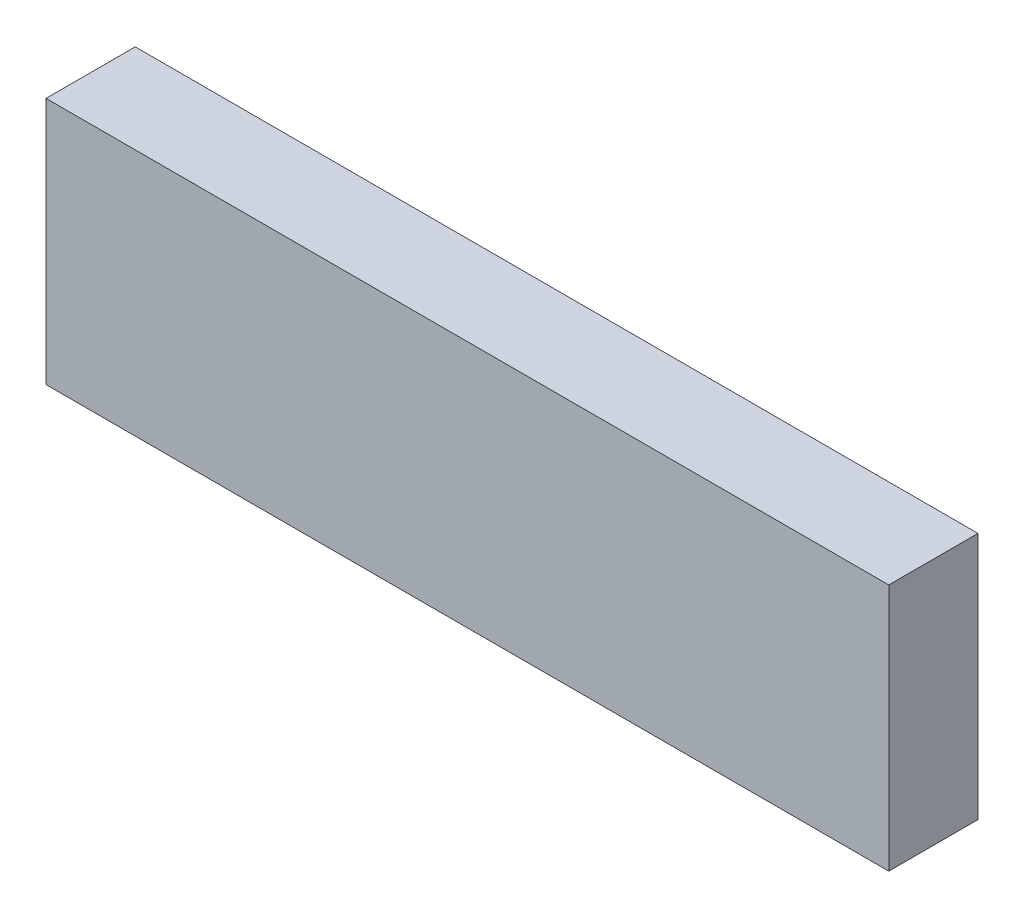
ISO-10303-21;
HEADER;
FILE_DESCRIPTION(('STEP AP214'),'2;1');
FILE_NAME('part.step','',(''),(''),'','','');
FILE_SCHEMA(('AUTOMOTIVE_DESIGN { 1 0 10303 214 1 1 1 1 }'));
ENDSEC;
DATA;
#1=APPLICATION_CONTEXT('core data for automotive mechanical design processes');
#2=APPLICATION_PROTOCOL_DEFINITION('international standard','automotive_design',2000,#1);
#3=PRODUCT_CONTEXT('',#1,'mechanical');
#4=PRODUCT('Part','Part','',(#3));
#5=PRODUCT_RELATED_PRODUCT_CATEGORY('part','',(#4));
#6=PRODUCT_DEFINITION_FORMATION('','',#4);
#7=PRODUCT_DEFINITION_CONTEXT('part definition',#1,'design');
#8=PRODUCT_DEFINITION('design','',#6,#7);
#9=PRODUCT_DEFINITION_SHAPE('','',#8);
#10=(LENGTH_UNIT() NAMED_UNIT(*) SI_UNIT(.MILLI.,.METRE.));
#11=(NAMED_UNIT(*) PLANE_ANGLE_UNIT() SI_UNIT($,.RADIAN.));
#12=(NAMED_UNIT(*) SI_UNIT($,.STERADIAN.) SOLID_ANGLE_UNIT());
#13=UNCERTAINTY_MEASURE_WITH_UNIT(LENGTH_MEASURE(1.E-05),#10,'distance_accuracy_value','');
#14=(GEOMETRIC_REPRESENTATION_CONTEXT(3) GLOBAL_UNCERTAINTY_ASSIGNED_CONTEXT((#13)) GLOBAL_UNIT_ASSIGNED_CONTEXT((#10,
#11,#12)) REPRESENTATION_CONTEXT('',''));
#15=CARTESIAN_POINT('',(0.,0.,0.));
#16=DIRECTION('',(0.,0.,1.));
#17=DIRECTION('',(1.,0.,0.));
#18=AXIS2_PLACEMENT_3D('',#15,#16,#17);
#19=CARTESIAN_POINT('',(0.,63.5,0.));
#20=DIRECTION('',(1.,0.,0.));
#21=DIRECTION('',(0.,0.,-1.));
#22=AXIS2_PLACEMENT_3D('',#19,#20,#21);
#23=PLANE('',#22);
#24=DIRECTION('',(0.,0.,1.));
#25=VECTOR('',#24,1.);
#26=CARTESIAN_POINT('',(0.,0.,0.));
#27=LINE('',#26,#25);
#28=CARTESIAN_POINT('',(0.,0.,-22.86));
#29=VERTEX_POINT('',#28);
#30=CARTESIAN_POINT('',(0.,0.,0.));
#31=VERTEX_POINT('',#30);
#32=EDGE_CURVE('E96',#29,#31,#27,.T.);
#33=ORIENTED_EDGE('',*,*,#32,.T.);
#34=DIRECTION('',(0.,-1.,0.));
#35=VECTOR('',#34,1.);
#36=CARTESIAN_POINT('',(0.,63.5,0.));
#37=LINE('',#36,#35);
#38=CARTESIAN_POINT('',(0.,63.5,0.));
#39=VERTEX_POINT('',#38);
#40=EDGE_CURVE('E11',#39,#31,#37,.T.);
#41=ORIENTED_EDGE('',*,*,#40,.F.);
#42=DIRECTION('',(0.,0.,1.));
#43=VECTOR('',#42,1.);
#44=CARTESIAN_POINT('',(0.,63.5,0.));
#45=LINE('',#44,#43);
#46=CARTESIAN_POINT('',(0.,63.5,-22.86));
#47=VERTEX_POINT('',#46);
#48=EDGE_CURVE('E84',#47,#39,#45,.T.);
#49=ORIENTED_EDGE('',*,*,#48,.F.);
#50=DIRECTION('',(0.,-1.,0.));
#51=VECTOR('',#50,1.);
#52=CARTESIAN_POINT('',(0.,63.5,-22.86));
#53=LINE('',#52,#51);
#54=EDGE_CURVE('E92',#47,#29,#53,.T.);
#55=ORIENTED_EDGE('',*,*,#54,.T.);
#56=EDGE_LOOP('',(#33,#41,#49,#55));
#57=FACE_BOUND('',#56,.T.);
#58=ADVANCED_FACE('F33',(#57),#23,.F.);
#59=CARTESIAN_POINT('',(0.,63.5,0.));
#60=DIRECTION('',(0.,0.,-1.));
#61=DIRECTION('',(-1.,0.,0.));
#62=AXIS2_PLACEMENT_3D('',#59,#60,#61);
#63=PLANE('',#62);
#64=DIRECTION('',(1.,0.,0.));
#65=VECTOR('',#64,1.);
#66=CARTESIAN_POINT('',(0.,0.,0.));
#67=LINE('',#66,#65);
#68=CARTESIAN_POINT('',(215.9,0.,0.));
#69=VERTEX_POINT('',#68);
#70=EDGE_CURVE('E88',#31,#69,#67,.T.);
#71=ORIENTED_EDGE('',*,*,#70,.T.);
#72=DIRECTION('',(0.,-1.,0.));
#73=VECTOR('',#72,1.);
#74=CARTESIAN_POINT('',(215.9,63.5,0.));
#75=LINE('',#74,#73);
#76=CARTESIAN_POINT('',(215.9,63.5,0.));
#77=VERTEX_POINT('',#76);
#78=EDGE_CURVE('E41',#77,#69,#75,.T.);
#79=ORIENTED_EDGE('',*,*,#78,.F.);
#80=DIRECTION('',(1.,0.,0.));
#81=VECTOR('',#80,1.);
#82=CARTESIAN_POINT('',(0.,63.5,0.));
#83=LINE('',#82,#81);
#84=EDGE_CURVE('E79',#39,#77,#83,.T.);
#85=ORIENTED_EDGE('',*,*,#84,.F.);
#86=ORIENTED_EDGE('',*,*,#40,.T.);
#87=EDGE_LOOP('',(#71,#79,#85,#86));
#88=FACE_BOUND('',#87,.T.);
#89=ADVANCED_FACE('F87',(#88),#63,.F.);
#90=CARTESIAN_POINT('',(215.9,63.5,0.));
#91=DIRECTION('',(-1.,0.,0.));
#92=DIRECTION('',(0.,0.,1.));
#93=AXIS2_PLACEMENT_3D('',#90,#91,#92);
#94=PLANE('',#93);
#95=DIRECTION('',(0.,0.,-1.));
#96=VECTOR('',#95,1.);
#97=CARTESIAN_POINT('',(215.9,0.,0.));
#98=LINE('',#97,#96);
#99=CARTESIAN_POINT('',(215.9,0.,-22.86));
#100=VERTEX_POINT('',#99);
#101=EDGE_CURVE('E66',#69,#100,#98,.T.);
#102=ORIENTED_EDGE('',*,*,#101,.T.);
#103=DIRECTION('',(0.,-1.,0.));
#104=VECTOR('',#103,1.);
#105=CARTESIAN_POINT('',(215.9,63.5,-22.86));
#106=LINE('',#105,#104);
#107=CARTESIAN_POINT('',(215.9,63.5,-22.86));
#108=VERTEX_POINT('',#107);
#109=EDGE_CURVE('E89',#108,#100,#106,.T.);
#110=ORIENTED_EDGE('',*,*,#109,.F.);
#111=DIRECTION('',(0.,0.,-1.));
#112=VECTOR('',#111,1.);
#113=CARTESIAN_POINT('',(215.9,63.5,0.));
#114=LINE('',#113,#112);
#115=EDGE_CURVE('E82',#77,#108,#114,.T.);
#116=ORIENTED_EDGE('',*,*,#115,.F.);
#117=ORIENTED_EDGE('',*,*,#78,.T.);
#118=EDGE_LOOP('',(#102,#110,#116,#117));
#119=FACE_BOUND('',#118,.T.);
#120=ADVANCED_FACE('F90',(#119),#94,.F.);
#121=CARTESIAN_POINT('',(0.,63.5,-22.86));
#122=DIRECTION('',(0.,0.,1.));
#123=DIRECTION('',(1.,0.,0.));
#124=AXIS2_PLACEMENT_3D('',#121,#122,#123);
#125=PLANE('',#124);
#126=DIRECTION('',(-1.,0.,0.));
#127=VECTOR('',#126,1.);
#128=CARTESIAN_POINT('',(0.,0.,-22.86));
#129=LINE('',#128,#127);
#130=EDGE_CURVE('E72',#100,#29,#129,.T.);
#131=ORIENTED_EDGE('',*,*,#130,.T.);
#132=ORIENTED_EDGE('',*,*,#54,.F.);
#133=DIRECTION('',(-1.,0.,0.));
#134=VECTOR('',#133,1.);
#135=CARTESIAN_POINT('',(0.,63.5,-22.86));
#136=LINE('',#135,#134);
#137=EDGE_CURVE('E49',#108,#47,#136,.T.);
#138=ORIENTED_EDGE('',*,*,#137,.F.);
#139=ORIENTED_EDGE('',*,*,#109,.T.);
#140=EDGE_LOOP('',(#131,#132,#138,#139));
#141=FACE_BOUND('',#140,.T.);
#142=ADVANCED_FACE('F103',(#141),#125,.F.);
#143=CARTESIAN_POINT('',(0.,63.5,0.));
#144=DIRECTION('',(0.,-1.,0.));
#145=DIRECTION('',(0.,0.,-1.));
#146=AXIS2_PLACEMENT_3D('',#143,#144,#145);
#147=PLANE('',#146);
#148=ORIENTED_EDGE('',*,*,#48,.T.);
#149=ORIENTED_EDGE('',*,*,#84,.T.);
#150=ORIENTED_EDGE('',*,*,#115,.T.);
#151=ORIENTED_EDGE('',*,*,#137,.T.);
#152=EDGE_LOOP('',(#148,#149,#150,#151));
#153=FACE_BOUND('',#152,.T.);
#154=ADVANCED_FACE('F80',(#153),#147,.F.);
#155=CARTESIAN_POINT('',(0.,0.,0.));
#156=DIRECTION('',(0.,-1.,0.));
#157=DIRECTION('',(0.,0.,-1.));
#158=AXIS2_PLACEMENT_3D('',#155,#156,#157);
#159=PLANE('',#158);
#160=ORIENTED_EDGE('',*,*,#32,.F.);
#161=ORIENTED_EDGE('',*,*,#130,.F.);
#162=ORIENTED_EDGE('',*,*,#101,.F.);
#163=ORIENTED_EDGE('',*,*,#70,.F.);
#164=EDGE_LOOP('',(#160,#161,#162,#163));
#165=FACE_BOUND('',#164,.T.);
#166=ADVANCED_FACE('F106',(#165),#159,.T.);
#167=CLOSED_SHELL('',(#58,#89,#120,#142,#154,#166));
#168=MANIFOLD_SOLID_BREP('B2',#167);
#169=ADVANCED_BREP_SHAPE_REPRESENTATION('',(#18,#168),#14);
#170=SHAPE_DEFINITION_REPRESENTATION(#9,#169);
ENDSEC;
END-ISO-10303-21;
